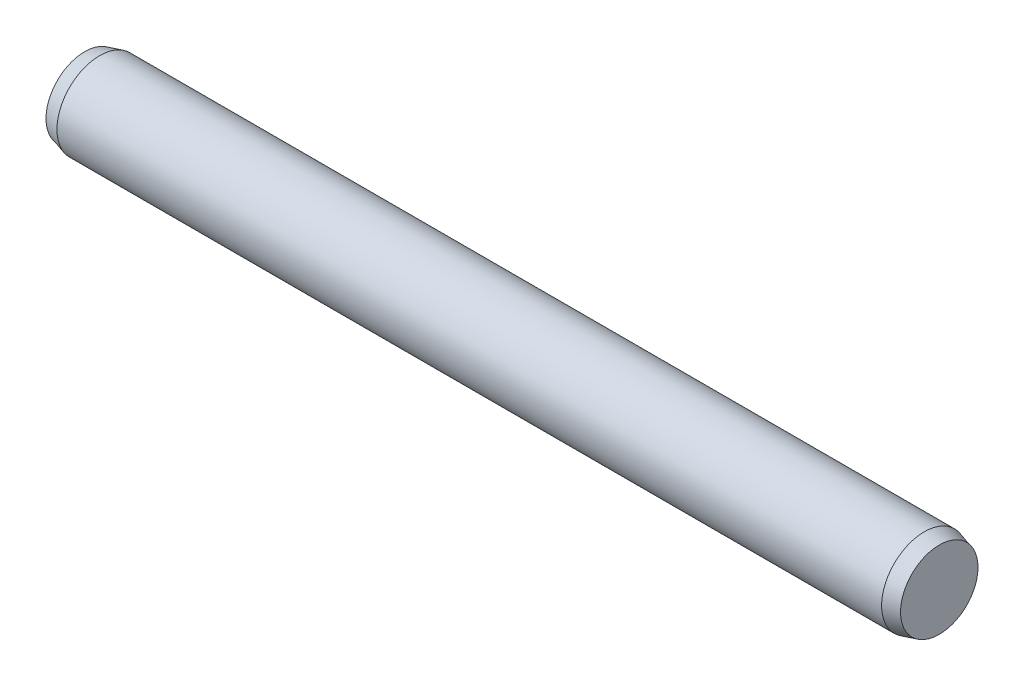
ISO-10303-21;
HEADER;
FILE_DESCRIPTION(('STEP AP214'),'2;1');
FILE_NAME('part.step','',(''),(''),'','','');
FILE_SCHEMA(('AUTOMOTIVE_DESIGN { 1 0 10303 214 1 1 1 1 }'));
ENDSEC;
DATA;
#1=APPLICATION_CONTEXT('core data for automotive mechanical design processes');
#2=APPLICATION_PROTOCOL_DEFINITION('international standard','automotive_design',2000,#1);
#3=PRODUCT_CONTEXT('',#1,'mechanical');
#4=PRODUCT('Part','Part','',(#3));
#5=PRODUCT_RELATED_PRODUCT_CATEGORY('part','',(#4));
#6=PRODUCT_DEFINITION_FORMATION('','',#4);
#7=PRODUCT_DEFINITION_CONTEXT('part definition',#1,'design');
#8=PRODUCT_DEFINITION('design','',#6,#7);
#9=PRODUCT_DEFINITION_SHAPE('','',#8);
#10=(LENGTH_UNIT() NAMED_UNIT(*) SI_UNIT(.MILLI.,.METRE.));
#11=(NAMED_UNIT(*) PLANE_ANGLE_UNIT() SI_UNIT($,.RADIAN.));
#12=(NAMED_UNIT(*) SI_UNIT($,.STERADIAN.) SOLID_ANGLE_UNIT());
#13=UNCERTAINTY_MEASURE_WITH_UNIT(LENGTH_MEASURE(1.E-05),#10,'distance_accuracy_value','');
#14=(GEOMETRIC_REPRESENTATION_CONTEXT(3) GLOBAL_UNCERTAINTY_ASSIGNED_CONTEXT((#13)) GLOBAL_UNIT_ASSIGNED_CONTEXT((#10,
#11,#12)) REPRESENTATION_CONTEXT('',''));
#15=CARTESIAN_POINT('',(0.,0.,0.));
#16=DIRECTION('',(0.,0.,1.));
#17=DIRECTION('',(1.,0.,0.));
#18=AXIS2_PLACEMENT_3D('',#15,#16,#17);
#19=CARTESIAN_POINT('',(-9.65,0.,0.));
#20=DIRECTION('',(1.,0.,0.));
#21=DIRECTION('',(0.,0.,-1.));
#22=AXIS2_PLACEMENT_3D('',#19,#20,#21);
#23=CYLINDRICAL_SURFACE('',#22,1.);
#24=CARTESIAN_POINT('',(-9.65,0.,0.));
#25=DIRECTION('',(-1.,0.,0.));
#26=DIRECTION('',(0.,0.,1.));
#27=AXIS2_PLACEMENT_3D('',#24,#25,#26);
#28=CIRCLE('',#27,1.);
#29=CARTESIAN_POINT('',(-9.65,0.,1.));
#30=VERTEX_POINT('',#29);
#31=EDGE_CURVE('E44',#30,#30,#28,.T.);
#32=ORIENTED_EDGE('',*,*,#31,.F.);
#33=EDGE_LOOP('',(#32));
#34=FACE_BOUND('',#33,.T.);
#35=CARTESIAN_POINT('',(9.65,0.,0.));
#36=DIRECTION('',(1.,0.,0.));
#37=DIRECTION('',(0.,0.,-1.));
#38=AXIS2_PLACEMENT_3D('',#35,#36,#37);
#39=CIRCLE('',#38,1.);
#40=CARTESIAN_POINT('',(9.65,0.,-1.));
#41=VERTEX_POINT('',#40);
#42=EDGE_CURVE('E10',#41,#41,#39,.T.);
#43=ORIENTED_EDGE('',*,*,#42,.F.);
#44=EDGE_LOOP('',(#43));
#45=FACE_BOUND('',#44,.T.);
#46=ADVANCED_FACE('F30',(#34,#45),#23,.T.);
#47=CARTESIAN_POINT('',(9.65,0.,0.));
#48=DIRECTION('',(-1.,0.,0.));
#49=DIRECTION('',(0.,0.,-1.));
#50=AXIS2_PLACEMENT_3D('',#47,#48,#49);
#51=CONICAL_SURFACE('',#50,1.,0.26179938779915);
#52=CARTESIAN_POINT('',(10.,0.,0.));
#53=DIRECTION('',(1.,0.,0.));
#54=DIRECTION('',(0.,0.,-1.));
#55=AXIS2_PLACEMENT_3D('',#52,#53,#54);
#56=CIRCLE('',#55,0.906217782649108);
#57=CARTESIAN_POINT('',(10.,0.,-0.906217782649108));
#58=VERTEX_POINT('',#57);
#59=EDGE_CURVE('E36',#58,#58,#56,.T.);
#60=ORIENTED_EDGE('',*,*,#59,.F.);
#61=EDGE_LOOP('',(#60));
#62=FACE_BOUND('',#61,.T.);
#63=ORIENTED_EDGE('',*,*,#42,.T.);
#64=EDGE_LOOP('',(#63));
#65=FACE_BOUND('',#64,.T.);
#66=ADVANCED_FACE('F54',(#62,#65),#51,.T.);
#67=CARTESIAN_POINT('',(10.,0.,0.));
#68=DIRECTION('',(1.,0.,0.));
#69=DIRECTION('',(0.,0.,-1.));
#70=AXIS2_PLACEMENT_3D('',#67,#68,#69);
#71=PLANE('',#70);
#72=ORIENTED_EDGE('',*,*,#59,.T.);
#73=EDGE_LOOP('',(#72));
#74=FACE_BOUND('',#73,.T.);
#75=ADVANCED_FACE('F58',(#74),#71,.T.);
#76=CARTESIAN_POINT('',(-9.65,0.,0.));
#77=DIRECTION('',(1.,0.,0.));
#78=DIRECTION('',(0.,0.,1.));
#79=AXIS2_PLACEMENT_3D('',#76,#77,#78);
#80=CONICAL_SURFACE('',#79,1.,0.26179938779915);
#81=CARTESIAN_POINT('',(-10.,0.,0.));
#82=DIRECTION('',(-1.,0.,0.));
#83=DIRECTION('',(0.,0.,1.));
#84=AXIS2_PLACEMENT_3D('',#81,#82,#83);
#85=CIRCLE('',#84,0.906217782649108);
#86=CARTESIAN_POINT('',(-10.,0.,0.906217782649108));
#87=VERTEX_POINT('',#86);
#88=EDGE_CURVE('E40',#87,#87,#85,.T.);
#89=ORIENTED_EDGE('',*,*,#88,.F.);
#90=EDGE_LOOP('',(#89));
#91=FACE_BOUND('',#90,.T.);
#92=ORIENTED_EDGE('',*,*,#31,.T.);
#93=EDGE_LOOP('',(#92));
#94=FACE_BOUND('',#93,.T.);
#95=ADVANCED_FACE('F50',(#91,#94),#80,.T.);
#96=CARTESIAN_POINT('',(-10.,0.,0.));
#97=DIRECTION('',(-1.,0.,0.));
#98=DIRECTION('',(0.,0.,1.));
#99=AXIS2_PLACEMENT_3D('',#96,#97,#98);
#100=PLANE('',#99);
#101=ORIENTED_EDGE('',*,*,#88,.T.);
#102=EDGE_LOOP('',(#101));
#103=FACE_BOUND('',#102,.T.);
#104=ADVANCED_FACE('F67',(#103),#100,.T.);
#105=CLOSED_SHELL('',(#46,#66,#75,#95,#104));
#106=MANIFOLD_SOLID_BREP('B2',#105);
#107=ADVANCED_BREP_SHAPE_REPRESENTATION('',(#18,#106),#14);
#108=SHAPE_DEFINITION_REPRESENTATION(#9,#107);
ENDSEC;
END-ISO-10303-21;
